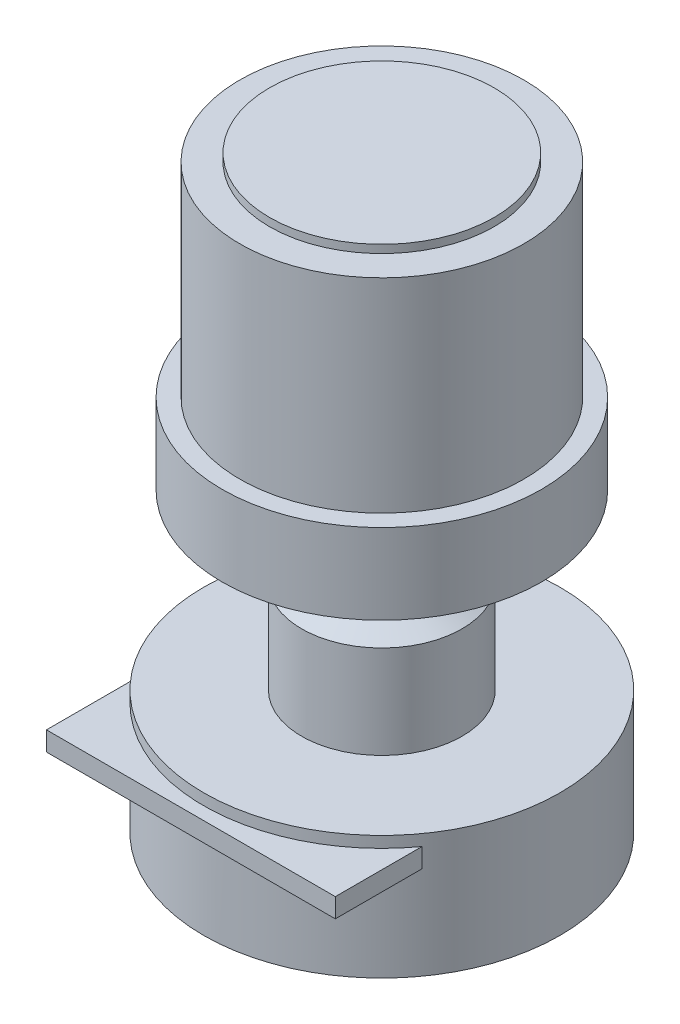
ISO-10303-21;
HEADER;
FILE_DESCRIPTION(('STEP AP214'),'2;1');
FILE_NAME('part.step','',(''),(''),'','','');
FILE_SCHEMA(('AUTOMOTIVE_DESIGN { 1 0 10303 214 1 1 1 1 }'));
ENDSEC;
DATA;
#1=APPLICATION_CONTEXT('core data for automotive mechanical design processes');
#2=APPLICATION_PROTOCOL_DEFINITION('international standard','automotive_design',2000,#1);
#3=PRODUCT_CONTEXT('',#1,'mechanical');
#4=PRODUCT('Part','Part','',(#3));
#5=PRODUCT_RELATED_PRODUCT_CATEGORY('part','',(#4));
#6=PRODUCT_DEFINITION_FORMATION('','',#4);
#7=PRODUCT_DEFINITION_CONTEXT('part definition',#1,'design');
#8=PRODUCT_DEFINITION('design','',#6,#7);
#9=PRODUCT_DEFINITION_SHAPE('','',#8);
#10=(LENGTH_UNIT() NAMED_UNIT(*) SI_UNIT(.MILLI.,.METRE.));
#11=(NAMED_UNIT(*) PLANE_ANGLE_UNIT() SI_UNIT($,.RADIAN.));
#12=(NAMED_UNIT(*) SI_UNIT($,.STERADIAN.) SOLID_ANGLE_UNIT());
#13=UNCERTAINTY_MEASURE_WITH_UNIT(LENGTH_MEASURE(1.E-05),#10,'distance_accuracy_value','');
#14=(GEOMETRIC_REPRESENTATION_CONTEXT(3) GLOBAL_UNCERTAINTY_ASSIGNED_CONTEXT((#13)) GLOBAL_UNIT_ASSIGNED_CONTEXT((#10,
#11,#12)) REPRESENTATION_CONTEXT('',''));
#15=CARTESIAN_POINT('',(0.,0.,0.));
#16=DIRECTION('',(0.,0.,1.));
#17=DIRECTION('',(1.,0.,0.));
#18=AXIS2_PLACEMENT_3D('',#15,#16,#17);
#19=CARTESIAN_POINT('',(0.,17.7,0.));
#20=DIRECTION('',(0.,-1.,0.));
#21=DIRECTION('',(0.,0.,-1.));
#22=AXIS2_PLACEMENT_3D('',#19,#20,#21);
#23=PLANE('',#22);
#24=CARTESIAN_POINT('',(0.,17.7,0.));
#25=DIRECTION('',(0.,1.,0.));
#26=DIRECTION('',(0.,0.,1.));
#27=AXIS2_PLACEMENT_3D('',#24,#25,#26);
#28=CIRCLE('',#27,7.);
#29=CARTESIAN_POINT('',(0.,17.7,7.));
#30=VERTEX_POINT('',#29);
#31=EDGE_CURVE('E11',#30,#30,#28,.T.);
#32=ORIENTED_EDGE('',*,*,#31,.F.);
#33=EDGE_LOOP('',(#32));
#34=FACE_BOUND('',#33,.T.);
#35=CARTESIAN_POINT('',(0.,17.7,0.));
#36=DIRECTION('',(0.,-1.,0.));
#37=DIRECTION('',(0.,0.,-1.));
#38=AXIS2_PLACEMENT_3D('',#35,#36,#37);
#39=CIRCLE('',#38,8.85);
#40=CARTESIAN_POINT('',(0.,17.7,-8.85));
#41=VERTEX_POINT('',#40);
#42=EDGE_CURVE('E42',#41,#41,#39,.T.);
#43=ORIENTED_EDGE('',*,*,#42,.F.);
#44=EDGE_LOOP('',(#43));
#45=FACE_BOUND('',#44,.T.);
#46=ADVANCED_FACE('F39',(#34,#45),#23,.F.);
#47=CARTESIAN_POINT('',(0.,-55.,0.));
#48=DIRECTION('',(0.,-1.,0.));
#49=DIRECTION('',(0.,0.,-1.));
#50=AXIS2_PLACEMENT_3D('',#47,#48,#49);
#51=CYLINDRICAL_SURFACE('',#50,8.85);
#52=CARTESIAN_POINT('',(0.,5.,0.));
#53=DIRECTION('',(0.,-1.,0.));
#54=DIRECTION('',(0.,0.,-1.));
#55=AXIS2_PLACEMENT_3D('',#52,#53,#54);
#56=CIRCLE('',#55,8.85);
#57=CARTESIAN_POINT('',(0.,5.,-8.85));
#58=VERTEX_POINT('',#57);
#59=EDGE_CURVE('E141',#58,#58,#56,.T.);
#60=ORIENTED_EDGE('',*,*,#59,.F.);
#61=EDGE_LOOP('',(#60));
#62=FACE_BOUND('',#61,.T.);
#63=ORIENTED_EDGE('',*,*,#42,.T.);
#64=EDGE_LOOP('',(#63));
#65=FACE_BOUND('',#64,.T.);
#66=ADVANCED_FACE('F148',(#62,#65),#51,.T.);
#67=CARTESIAN_POINT('',(-8.85,5.,0.));
#68=DIRECTION('',(0.,-1.,0.));
#69=DIRECTION('',(0.,0.,-1.));
#70=AXIS2_PLACEMENT_3D('',#67,#68,#69);
#71=PLANE('',#70);
#72=CARTESIAN_POINT('',(0.,5.,0.));
#73=DIRECTION('',(0.,-1.,0.));
#74=DIRECTION('',(0.,0.,-1.));
#75=AXIS2_PLACEMENT_3D('',#72,#73,#74);
#76=CIRCLE('',#75,9.95);
#77=CARTESIAN_POINT('',(0.,5.,-9.95));
#78=VERTEX_POINT('',#77);
#79=EDGE_CURVE('E139',#78,#78,#76,.T.);
#80=ORIENTED_EDGE('',*,*,#79,.F.);
#81=EDGE_LOOP('',(#80));
#82=FACE_BOUND('',#81,.T.);
#83=ORIENTED_EDGE('',*,*,#59,.T.);
#84=EDGE_LOOP('',(#83));
#85=FACE_BOUND('',#84,.T.);
#86=ADVANCED_FACE('F155',(#82,#85),#71,.F.);
#87=CARTESIAN_POINT('',(0.,-55.,0.));
#88=DIRECTION('',(0.,-1.,0.));
#89=DIRECTION('',(0.,0.,-1.));
#90=AXIS2_PLACEMENT_3D('',#87,#88,#89);
#91=CYLINDRICAL_SURFACE('',#90,9.95);
#92=CARTESIAN_POINT('',(0.,0.,0.));
#93=DIRECTION('',(0.,-1.,0.));
#94=DIRECTION('',(0.,0.,-1.));
#95=AXIS2_PLACEMENT_3D('',#92,#93,#94);
#96=CIRCLE('',#95,9.95);
#97=CARTESIAN_POINT('',(0.,0.,-9.95));
#98=VERTEX_POINT('',#97);
#99=EDGE_CURVE('E136',#98,#98,#96,.T.);
#100=ORIENTED_EDGE('',*,*,#99,.F.);
#101=EDGE_LOOP('',(#100));
#102=FACE_BOUND('',#101,.T.);
#103=ORIENTED_EDGE('',*,*,#79,.T.);
#104=EDGE_LOOP('',(#103));
#105=FACE_BOUND('',#104,.T.);
#106=ADVANCED_FACE('F211',(#102,#105),#91,.T.);
#107=CARTESIAN_POINT('',(-9.95,0.,0.));
#108=DIRECTION('',(0.,1.,0.));
#109=DIRECTION('',(0.,0.,1.));
#110=AXIS2_PLACEMENT_3D('',#107,#108,#109);
#111=PLANE('',#110);
#112=CARTESIAN_POINT('',(0.,0.,0.));
#113=DIRECTION('',(0.,-1.,0.));
#114=DIRECTION('',(0.,0.,-1.));
#115=AXIS2_PLACEMENT_3D('',#112,#113,#114);
#116=CIRCLE('',#115,3.);
#117=CARTESIAN_POINT('',(0.,0.,-3.));
#118=VERTEX_POINT('',#117);
#119=EDGE_CURVE('E133',#118,#118,#116,.T.);
#120=ORIENTED_EDGE('',*,*,#119,.F.);
#121=EDGE_LOOP('',(#120));
#122=FACE_BOUND('',#121,.T.);
#123=ORIENTED_EDGE('',*,*,#99,.T.);
#124=EDGE_LOOP('',(#123));
#125=FACE_BOUND('',#124,.T.);
#126=ADVANCED_FACE('F207',(#122,#125),#111,.F.);
#127=CARTESIAN_POINT('',(0.,-55.,0.));
#128=DIRECTION('',(0.,-1.,0.));
#129=DIRECTION('',(0.,0.,-1.));
#130=AXIS2_PLACEMENT_3D('',#127,#128,#129);
#131=CYLINDRICAL_SURFACE('',#130,3.);
#132=CARTESIAN_POINT('',(0.,-4.,0.));
#133=DIRECTION('',(0.,-1.,0.));
#134=DIRECTION('',(0.,0.,-1.));
#135=AXIS2_PLACEMENT_3D('',#132,#133,#134);
#136=CIRCLE('',#135,3.);
#137=CARTESIAN_POINT('',(0.,-4.,-3.));
#138=VERTEX_POINT('',#137);
#139=EDGE_CURVE('E130',#138,#138,#136,.T.);
#140=ORIENTED_EDGE('',*,*,#139,.F.);
#141=EDGE_LOOP('',(#140));
#142=FACE_BOUND('',#141,.T.);
#143=ORIENTED_EDGE('',*,*,#119,.T.);
#144=EDGE_LOOP('',(#143));
#145=FACE_BOUND('',#144,.T.);
#146=ADVANCED_FACE('F203',(#142,#145),#131,.T.);
#147=CARTESIAN_POINT('',(0.,-4.,0.));
#148=DIRECTION('',(0.,-1.,0.));
#149=DIRECTION('',(0.,0.,-1.));
#150=AXIS2_PLACEMENT_3D('',#147,#148,#149);
#151=CONICAL_SURFACE('',#150,3.,1.10714871779409);
#152=CARTESIAN_POINT('',(0.,-5.,0.));
#153=DIRECTION('',(0.,-1.,0.));
#154=DIRECTION('',(0.,0.,-1.));
#155=AXIS2_PLACEMENT_3D('',#152,#153,#154);
#156=CIRCLE('',#155,5.);
#157=CARTESIAN_POINT('',(0.,-5.,-5.));
#158=VERTEX_POINT('',#157);
#159=EDGE_CURVE('E127',#158,#158,#156,.T.);
#160=ORIENTED_EDGE('',*,*,#159,.F.);
#161=EDGE_LOOP('',(#160));
#162=FACE_BOUND('',#161,.T.);
#163=ORIENTED_EDGE('',*,*,#139,.T.);
#164=EDGE_LOOP('',(#163));
#165=FACE_BOUND('',#164,.T.);
#166=ADVANCED_FACE('F199',(#162,#165),#151,.T.);
#167=CARTESIAN_POINT('',(0.,-55.,0.));
#168=DIRECTION('',(0.,-1.,0.));
#169=DIRECTION('',(0.,0.,-1.));
#170=AXIS2_PLACEMENT_3D('',#167,#168,#169);
#171=CYLINDRICAL_SURFACE('',#170,5.);
#172=CARTESIAN_POINT('',(0.,-10.8,0.));
#173=DIRECTION('',(0.,-1.,0.));
#174=DIRECTION('',(0.,0.,-1.));
#175=AXIS2_PLACEMENT_3D('',#172,#173,#174);
#176=CIRCLE('',#175,5.);
#177=CARTESIAN_POINT('',(0.,-10.8,-5.));
#178=VERTEX_POINT('',#177);
#179=EDGE_CURVE('E124',#178,#178,#176,.T.);
#180=ORIENTED_EDGE('',*,*,#179,.F.);
#181=EDGE_LOOP('',(#180));
#182=FACE_BOUND('',#181,.T.);
#183=ORIENTED_EDGE('',*,*,#159,.T.);
#184=EDGE_LOOP('',(#183));
#185=FACE_BOUND('',#184,.T.);
#186=ADVANCED_FACE('F195',(#182,#185),#171,.T.);
#187=CARTESIAN_POINT('',(-5.,-10.8,0.));
#188=DIRECTION('',(0.,-1.,0.));
#189=DIRECTION('',(0.,0.,-1.));
#190=AXIS2_PLACEMENT_3D('',#187,#188,#189);
#191=PLANE('',#190);
#192=CARTESIAN_POINT('',(0.,-10.8,0.));
#193=DIRECTION('',(0.,-1.,0.));
#194=DIRECTION('',(0.,0.,-1.));
#195=AXIS2_PLACEMENT_3D('',#192,#193,#194);
#196=CIRCLE('',#195,11.1);
#197=CARTESIAN_POINT('',(0.,-10.8,-11.1));
#198=VERTEX_POINT('',#197);
#199=EDGE_CURVE('E121',#198,#198,#196,.T.);
#200=ORIENTED_EDGE('',*,*,#199,.F.);
#201=EDGE_LOOP('',(#200));
#202=FACE_BOUND('',#201,.T.);
#203=ORIENTED_EDGE('',*,*,#179,.T.);
#204=EDGE_LOOP('',(#203));
#205=FACE_BOUND('',#204,.T.);
#206=ADVANCED_FACE('F192',(#202,#205),#191,.F.);
#207=CARTESIAN_POINT('',(0.,-55.,0.));
#208=DIRECTION('',(0.,-1.,0.));
#209=DIRECTION('',(0.,0.,-1.));
#210=AXIS2_PLACEMENT_3D('',#207,#208,#209);
#211=CYLINDRICAL_SURFACE('',#210,11.1);
#212=DIRECTION('',(0.,1.,0.));
#213=VECTOR('',#212,1.);
#214=CARTESIAN_POINT('',(9.,-12.7,6.49692234831231));
#215=LINE('',#214,#213);
#216=CARTESIAN_POINT('',(9.,-12.7,6.49692234831231));
#217=VERTEX_POINT('',#216);
#218=CARTESIAN_POINT('',(9.,-11.5,6.49692234831231));
#219=VERTEX_POINT('',#218);
#220=EDGE_CURVE('E59',#217,#219,#215,.T.);
#221=ORIENTED_EDGE('',*,*,#220,.F.);
#222=CARTESIAN_POINT('',(0.,-12.7,0.));
#223=DIRECTION('',(0.,-1.,0.));
#224=DIRECTION('',(0.,0.,-1.));
#225=AXIS2_PLACEMENT_3D('',#222,#223,#224);
#226=CIRCLE('',#225,11.1);
#227=CARTESIAN_POINT('',(-9.,-12.7,6.49692234831231));
#228=VERTEX_POINT('',#227);
#229=EDGE_CURVE('E54',#217,#228,#226,.T.);
#230=ORIENTED_EDGE('',*,*,#229,.T.);
#231=DIRECTION('',(0.,1.,0.));
#232=VECTOR('',#231,1.);
#233=CARTESIAN_POINT('',(-9.,-12.7,6.49692234831231));
#234=LINE('',#233,#232);
#235=CARTESIAN_POINT('',(-9.,-11.5,6.49692234831231));
#236=VERTEX_POINT('',#235);
#237=EDGE_CURVE('E99',#228,#236,#234,.T.);
#238=ORIENTED_EDGE('',*,*,#237,.T.);
#239=CARTESIAN_POINT('',(0.,-11.5,0.));
#240=DIRECTION('',(0.,-1.,0.));
#241=DIRECTION('',(0.,0.,-1.));
#242=AXIS2_PLACEMENT_3D('',#239,#240,#241);
#243=CIRCLE('',#242,11.1);
#244=EDGE_CURVE('E100',#219,#236,#243,.T.);
#245=ORIENTED_EDGE('',*,*,#244,.F.);
#246=EDGE_LOOP('',(#221,#230,#238,#245));
#247=FACE_BOUND('',#246,.T.);
#248=CARTESIAN_POINT('',(0.,-18.5,0.));
#249=DIRECTION('',(0.,-1.,0.));
#250=DIRECTION('',(0.,0.,-1.));
#251=AXIS2_PLACEMENT_3D('',#248,#249,#250);
#252=CIRCLE('',#251,11.1);
#253=CARTESIAN_POINT('',(0.,-18.5,-11.1));
#254=VERTEX_POINT('',#253);
#255=EDGE_CURVE('E116',#254,#254,#252,.T.);
#256=ORIENTED_EDGE('',*,*,#255,.F.);
#257=EDGE_LOOP('',(#256));
#258=FACE_BOUND('',#257,.T.);
#259=ORIENTED_EDGE('',*,*,#199,.T.);
#260=EDGE_LOOP('',(#259));
#261=FACE_BOUND('',#260,.T.);
#262=ADVANCED_FACE('F188',(#247,#258,#261),#211,.T.);
#263=CARTESIAN_POINT('',(-11.1,-18.5,0.));
#264=DIRECTION('',(0.,1.,0.));
#265=DIRECTION('',(0.,0.,1.));
#266=AXIS2_PLACEMENT_3D('',#263,#264,#265);
#267=PLANE('',#266);
#268=ORIENTED_EDGE('',*,*,#255,.T.);
#269=EDGE_LOOP('',(#268));
#270=FACE_BOUND('',#269,.T.);
#271=ADVANCED_FACE('F185',(#270),#267,.F.);
#272=CARTESIAN_POINT('',(-9.,-12.7,6.49692234831231));
#273=DIRECTION('',(-1.,0.,0.));
#274=DIRECTION('',(0.,0.,1.));
#275=AXIS2_PLACEMENT_3D('',#272,#273,#274);
#276=PLANE('',#275);
#277=DIRECTION('',(0.,0.,1.));
#278=VECTOR('',#277,1.);
#279=CARTESIAN_POINT('',(-9.,-11.5,6.49692234831231));
#280=LINE('',#279,#278);
#281=CARTESIAN_POINT('',(-9.,-11.5,11.9));
#282=VERTEX_POINT('',#281);
#283=EDGE_CURVE('E109',#236,#282,#280,.T.);
#284=ORIENTED_EDGE('',*,*,#283,.F.);
#285=ORIENTED_EDGE('',*,*,#237,.F.);
#286=DIRECTION('',(0.,0.,1.));
#287=VECTOR('',#286,1.);
#288=CARTESIAN_POINT('',(-9.,-12.7,6.49692234831231));
#289=LINE('',#288,#287);
#290=CARTESIAN_POINT('',(-9.,-12.7,11.9));
#291=VERTEX_POINT('',#290);
#292=EDGE_CURVE('E95',#228,#291,#289,.T.);
#293=ORIENTED_EDGE('',*,*,#292,.T.);
#294=DIRECTION('',(0.,1.,0.));
#295=VECTOR('',#294,1.);
#296=CARTESIAN_POINT('',(-9.,-12.7,11.9));
#297=LINE('',#296,#295);
#298=EDGE_CURVE('E79',#291,#282,#297,.T.);
#299=ORIENTED_EDGE('',*,*,#298,.T.);
#300=EDGE_LOOP('',(#284,#285,#293,#299));
#301=FACE_BOUND('',#300,.T.);
#302=ADVANCED_FACE('F98',(#301),#276,.T.);
#303=CARTESIAN_POINT('',(9.,-12.7,11.9));
#304=DIRECTION('',(1.,0.,0.));
#305=DIRECTION('',(0.,0.,-1.));
#306=AXIS2_PLACEMENT_3D('',#303,#304,#305);
#307=PLANE('',#306);
#308=DIRECTION('',(0.,0.,-1.));
#309=VECTOR('',#308,1.);
#310=CARTESIAN_POINT('',(9.,-11.5,11.9));
#311=LINE('',#310,#309);
#312=CARTESIAN_POINT('',(9.,-11.5,11.9));
#313=VERTEX_POINT('',#312);
#314=EDGE_CURVE('E103',#313,#219,#311,.T.);
#315=ORIENTED_EDGE('',*,*,#314,.F.);
#316=DIRECTION('',(0.,1.,0.));
#317=VECTOR('',#316,1.);
#318=CARTESIAN_POINT('',(9.,-12.7,11.9));
#319=LINE('',#318,#317);
#320=CARTESIAN_POINT('',(9.,-12.7,11.9));
#321=VERTEX_POINT('',#320);
#322=EDGE_CURVE('E89',#321,#313,#319,.T.);
#323=ORIENTED_EDGE('',*,*,#322,.F.);
#324=DIRECTION('',(0.,0.,-1.));
#325=VECTOR('',#324,1.);
#326=CARTESIAN_POINT('',(9.,-12.7,11.9));
#327=LINE('',#326,#325);
#328=EDGE_CURVE('E96',#321,#217,#327,.T.);
#329=ORIENTED_EDGE('',*,*,#328,.T.);
#330=ORIENTED_EDGE('',*,*,#220,.T.);
#331=EDGE_LOOP('',(#315,#323,#329,#330));
#332=FACE_BOUND('',#331,.T.);
#333=ADVANCED_FACE('F177',(#332),#307,.T.);
#334=CARTESIAN_POINT('',(-9.,-12.7,11.9));
#335=DIRECTION('',(0.,0.,1.));
#336=DIRECTION('',(1.,0.,0.));
#337=AXIS2_PLACEMENT_3D('',#334,#335,#336);
#338=PLANE('',#337);
#339=DIRECTION('',(1.,0.,0.));
#340=VECTOR('',#339,1.);
#341=CARTESIAN_POINT('',(-9.,-11.5,11.9));
#342=LINE('',#341,#340);
#343=EDGE_CURVE('E84',#282,#313,#342,.T.);
#344=ORIENTED_EDGE('',*,*,#343,.F.);
#345=ORIENTED_EDGE('',*,*,#298,.F.);
#346=DIRECTION('',(1.,0.,0.));
#347=VECTOR('',#346,1.);
#348=CARTESIAN_POINT('',(-9.,-12.7,11.9));
#349=LINE('',#348,#347);
#350=EDGE_CURVE('E82',#291,#321,#349,.T.);
#351=ORIENTED_EDGE('',*,*,#350,.T.);
#352=ORIENTED_EDGE('',*,*,#322,.T.);
#353=EDGE_LOOP('',(#344,#345,#351,#352));
#354=FACE_BOUND('',#353,.T.);
#355=ADVANCED_FACE('F81',(#354),#338,.T.);
#356=CARTESIAN_POINT('',(0.,-12.7,0.));
#357=DIRECTION('',(0.,-1.,0.));
#358=DIRECTION('',(0.,0.,-1.));
#359=AXIS2_PLACEMENT_3D('',#356,#357,#358);
#360=PLANE('',#359);
#361=ORIENTED_EDGE('',*,*,#292,.F.);
#362=ORIENTED_EDGE('',*,*,#229,.F.);
#363=ORIENTED_EDGE('',*,*,#328,.F.);
#364=ORIENTED_EDGE('',*,*,#350,.F.);
#365=EDGE_LOOP('',(#361,#362,#363,#364));
#366=FACE_BOUND('',#365,.T.);
#367=ADVANCED_FACE('F94',(#366),#360,.T.);
#368=CARTESIAN_POINT('',(0.,-11.5,0.));
#369=DIRECTION('',(0.,-1.,0.));
#370=DIRECTION('',(0.,0.,-1.));
#371=AXIS2_PLACEMENT_3D('',#368,#369,#370);
#372=PLANE('',#371);
#373=ORIENTED_EDGE('',*,*,#283,.T.);
#374=ORIENTED_EDGE('',*,*,#343,.T.);
#375=ORIENTED_EDGE('',*,*,#314,.T.);
#376=ORIENTED_EDGE('',*,*,#244,.T.);
#377=EDGE_LOOP('',(#373,#374,#375,#376));
#378=FACE_BOUND('',#377,.T.);
#379=ADVANCED_FACE('F162',(#378),#372,.F.);
#380=CARTESIAN_POINT('',(0.,18.2,0.));
#381=DIRECTION('',(0.,-1.,0.));
#382=DIRECTION('',(0.,0.,-1.));
#383=AXIS2_PLACEMENT_3D('',#380,#381,#382);
#384=CYLINDRICAL_SURFACE('',#383,7.);
#385=CARTESIAN_POINT('',(0.,18.2,0.));
#386=DIRECTION('',(0.,1.,0.));
#387=DIRECTION('',(0.,0.,1.));
#388=AXIS2_PLACEMENT_3D('',#385,#386,#387);
#389=CIRCLE('',#388,7.);
#390=CARTESIAN_POINT('',(0.,18.2,7.));
#391=VERTEX_POINT('',#390);
#392=EDGE_CURVE('E111',#391,#391,#389,.T.);
#393=ORIENTED_EDGE('',*,*,#392,.F.);
#394=EDGE_LOOP('',(#393));
#395=FACE_BOUND('',#394,.T.);
#396=ORIENTED_EDGE('',*,*,#31,.T.);
#397=EDGE_LOOP('',(#396));
#398=FACE_BOUND('',#397,.T.);
#399=ADVANCED_FACE('F159',(#395,#398),#384,.T.);
#400=CARTESIAN_POINT('',(0.,18.2,0.));
#401=DIRECTION('',(0.,1.,0.));
#402=DIRECTION('',(0.,0.,1.));
#403=AXIS2_PLACEMENT_3D('',#400,#401,#402);
#404=PLANE('',#403);
#405=ORIENTED_EDGE('',*,*,#392,.T.);
#406=EDGE_LOOP('',(#405));
#407=FACE_BOUND('',#406,.T.);
#408=ADVANCED_FACE('F161',(#407),#404,.T.);
#409=CLOSED_SHELL('',(#46,#66,#86,#106,#126,#146,#166,#186,#206,#262,#271,#302,#333,#355,#367,
#379,#399,#408));
#410=MANIFOLD_SOLID_BREP('B2',#409);
#411=ADVANCED_BREP_SHAPE_REPRESENTATION('',(#18,#410),#14);
#412=SHAPE_DEFINITION_REPRESENTATION(#9,#411);
ENDSEC;
END-ISO-10303-21;
